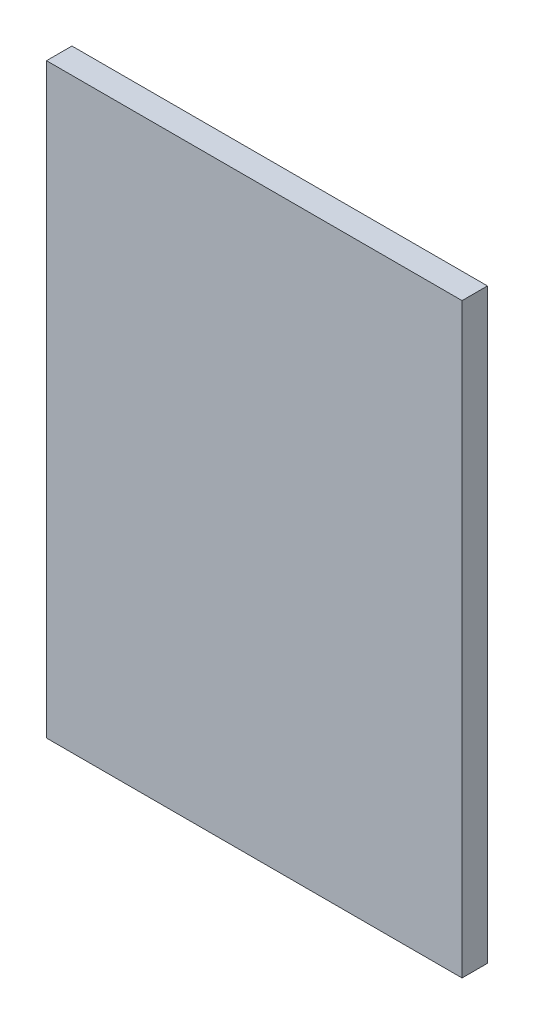
ISO-10303-21;
HEADER;
FILE_DESCRIPTION(('STEP AP214'),'2;1');
FILE_NAME('part.step','',(''),(''),'','','');
FILE_SCHEMA(('AUTOMOTIVE_DESIGN { 1 0 10303 214 1 1 1 1 }'));
ENDSEC;
DATA;
#1=APPLICATION_CONTEXT('core data for automotive mechanical design processes');
#2=APPLICATION_PROTOCOL_DEFINITION('international standard','automotive_design',2000,#1);
#3=PRODUCT_CONTEXT('',#1,'mechanical');
#4=PRODUCT('Part','Part','',(#3));
#5=PRODUCT_RELATED_PRODUCT_CATEGORY('part','',(#4));
#6=PRODUCT_DEFINITION_FORMATION('','',#4);
#7=PRODUCT_DEFINITION_CONTEXT('part definition',#1,'design');
#8=PRODUCT_DEFINITION('design','',#6,#7);
#9=PRODUCT_DEFINITION_SHAPE('','',#8);
#10=(LENGTH_UNIT() NAMED_UNIT(*) SI_UNIT(.MILLI.,.METRE.));
#11=(NAMED_UNIT(*) PLANE_ANGLE_UNIT() SI_UNIT($,.RADIAN.));
#12=(NAMED_UNIT(*) SI_UNIT($,.STERADIAN.) SOLID_ANGLE_UNIT());
#13=UNCERTAINTY_MEASURE_WITH_UNIT(LENGTH_MEASURE(1.E-05),#10,'distance_accuracy_value','');
#14=(GEOMETRIC_REPRESENTATION_CONTEXT(3) GLOBAL_UNCERTAINTY_ASSIGNED_CONTEXT((#13)) GLOBAL_UNIT_ASSIGNED_CONTEXT((#10,
#11,#12)) REPRESENTATION_CONTEXT('',''));
#15=CARTESIAN_POINT('',(0.,0.,0.));
#16=DIRECTION('',(0.,0.,1.));
#17=DIRECTION('',(1.,0.,0.));
#18=AXIS2_PLACEMENT_3D('',#15,#16,#17);
#19=CARTESIAN_POINT('',(-26.9875,-38.1,3.302));
#20=DIRECTION('',(1.,0.,0.));
#21=DIRECTION('',(0.,0.,-1.));
#22=AXIS2_PLACEMENT_3D('',#19,#20,#21);
#23=PLANE('',#22);
#24=DIRECTION('',(0.,-1.,0.));
#25=VECTOR('',#24,1.);
#26=CARTESIAN_POINT('',(-26.9875,-38.1,0.));
#27=LINE('',#26,#25);
#28=CARTESIAN_POINT('',(-26.9875,38.1,0.));
#29=VERTEX_POINT('',#28);
#30=CARTESIAN_POINT('',(-26.9875,-38.1,0.));
#31=VERTEX_POINT('',#30);
#32=EDGE_CURVE('E107',#29,#31,#27,.T.);
#33=ORIENTED_EDGE('',*,*,#32,.T.);
#34=DIRECTION('',(0.,0.,-1.));
#35=VECTOR('',#34,1.);
#36=CARTESIAN_POINT('',(-26.9875,-38.1,3.302));
#37=LINE('',#36,#35);
#38=CARTESIAN_POINT('',(-26.9875,-38.1,3.302));
#39=VERTEX_POINT('',#38);
#40=EDGE_CURVE('E11',#39,#31,#37,.T.);
#41=ORIENTED_EDGE('',*,*,#40,.F.);
#42=DIRECTION('',(0.,-1.,0.));
#43=VECTOR('',#42,1.);
#44=CARTESIAN_POINT('',(-26.9875,-38.1,3.302));
#45=LINE('',#44,#43);
#46=CARTESIAN_POINT('',(-26.9875,38.1,3.302));
#47=VERTEX_POINT('',#46);
#48=EDGE_CURVE('E91',#47,#39,#45,.T.);
#49=ORIENTED_EDGE('',*,*,#48,.F.);
#50=DIRECTION('',(0.,0.,-1.));
#51=VECTOR('',#50,1.);
#52=CARTESIAN_POINT('',(-26.9875,38.1,3.302));
#53=LINE('',#52,#51);
#54=EDGE_CURVE('E103',#47,#29,#53,.T.);
#55=ORIENTED_EDGE('',*,*,#54,.T.);
#56=EDGE_LOOP('',(#33,#41,#49,#55));
#57=FACE_BOUND('',#56,.T.);
#58=ADVANCED_FACE('F39',(#57),#23,.F.);
#59=CARTESIAN_POINT('',(26.9875,-38.1,3.302));
#60=DIRECTION('',(0.,1.,0.));
#61=DIRECTION('',(-1.,0.,0.));
#62=AXIS2_PLACEMENT_3D('',#59,#60,#61);
#63=PLANE('',#62);
#64=DIRECTION('',(1.,0.,0.));
#65=VECTOR('',#64,1.);
#66=CARTESIAN_POINT('',(26.9875,-38.1,0.));
#67=LINE('',#66,#65);
#68=CARTESIAN_POINT('',(26.9875,-38.1,0.));
#69=VERTEX_POINT('',#68);
#70=EDGE_CURVE('E96',#31,#69,#67,.T.);
#71=ORIENTED_EDGE('',*,*,#70,.T.);
#72=DIRECTION('',(0.,0.,-1.));
#73=VECTOR('',#72,1.);
#74=CARTESIAN_POINT('',(26.9875,-38.1,3.302));
#75=LINE('',#74,#73);
#76=CARTESIAN_POINT('',(26.9875,-38.1,3.302));
#77=VERTEX_POINT('',#76);
#78=EDGE_CURVE('E48',#77,#69,#75,.T.);
#79=ORIENTED_EDGE('',*,*,#78,.F.);
#80=DIRECTION('',(1.,0.,0.));
#81=VECTOR('',#80,1.);
#82=CARTESIAN_POINT('',(26.9875,-38.1,3.302));
#83=LINE('',#82,#81);
#84=EDGE_CURVE('E86',#39,#77,#83,.T.);
#85=ORIENTED_EDGE('',*,*,#84,.F.);
#86=ORIENTED_EDGE('',*,*,#40,.T.);
#87=EDGE_LOOP('',(#71,#79,#85,#86));
#88=FACE_BOUND('',#87,.T.);
#89=ADVANCED_FACE('F95',(#88),#63,.F.);
#90=CARTESIAN_POINT('',(26.9875,-38.1,3.302));
#91=DIRECTION('',(-1.,0.,0.));
#92=DIRECTION('',(0.,0.,1.));
#93=AXIS2_PLACEMENT_3D('',#90,#91,#92);
#94=PLANE('',#93);
#95=DIRECTION('',(0.,1.,0.));
#96=VECTOR('',#95,1.);
#97=CARTESIAN_POINT('',(26.9875,-38.1,0.));
#98=LINE('',#97,#96);
#99=CARTESIAN_POINT('',(26.9875,38.1,0.));
#100=VERTEX_POINT('',#99);
#101=EDGE_CURVE('E73',#69,#100,#98,.T.);
#102=ORIENTED_EDGE('',*,*,#101,.T.);
#103=DIRECTION('',(0.,0.,-1.));
#104=VECTOR('',#103,1.);
#105=CARTESIAN_POINT('',(26.9875,38.1,3.302));
#106=LINE('',#105,#104);
#107=CARTESIAN_POINT('',(26.9875,38.1,3.302));
#108=VERTEX_POINT('',#107);
#109=EDGE_CURVE('E98',#108,#100,#106,.T.);
#110=ORIENTED_EDGE('',*,*,#109,.F.);
#111=DIRECTION('',(0.,1.,0.));
#112=VECTOR('',#111,1.);
#113=CARTESIAN_POINT('',(26.9875,-38.1,3.302));
#114=LINE('',#113,#112);
#115=EDGE_CURVE('E89',#77,#108,#114,.T.);
#116=ORIENTED_EDGE('',*,*,#115,.F.);
#117=ORIENTED_EDGE('',*,*,#78,.T.);
#118=EDGE_LOOP('',(#102,#110,#116,#117));
#119=FACE_BOUND('',#118,.T.);
#120=ADVANCED_FACE('F99',(#119),#94,.F.);
#121=CARTESIAN_POINT('',(26.9875,38.1,3.302));
#122=DIRECTION('',(0.,-1.,0.));
#123=DIRECTION('',(1.,0.,0.));
#124=AXIS2_PLACEMENT_3D('',#121,#122,#123);
#125=PLANE('',#124);
#126=DIRECTION('',(-1.,0.,0.));
#127=VECTOR('',#126,1.);
#128=CARTESIAN_POINT('',(26.9875,38.1,0.));
#129=LINE('',#128,#127);
#130=EDGE_CURVE('E79',#100,#29,#129,.T.);
#131=ORIENTED_EDGE('',*,*,#130,.T.);
#132=ORIENTED_EDGE('',*,*,#54,.F.);
#133=DIRECTION('',(-1.,0.,0.));
#134=VECTOR('',#133,1.);
#135=CARTESIAN_POINT('',(26.9875,38.1,3.302));
#136=LINE('',#135,#134);
#137=EDGE_CURVE('E56',#108,#47,#136,.T.);
#138=ORIENTED_EDGE('',*,*,#137,.F.);
#139=ORIENTED_EDGE('',*,*,#109,.T.);
#140=EDGE_LOOP('',(#131,#132,#138,#139));
#141=FACE_BOUND('',#140,.T.);
#142=ADVANCED_FACE('F120',(#141),#125,.F.);
#143=CARTESIAN_POINT('',(0.,0.,3.302));
#144=DIRECTION('',(0.,0.,1.));
#145=DIRECTION('',(1.,0.,0.));
#146=AXIS2_PLACEMENT_3D('',#143,#144,#145);
#147=PLANE('',#146);
#148=ORIENTED_EDGE('',*,*,#48,.T.);
#149=ORIENTED_EDGE('',*,*,#84,.T.);
#150=ORIENTED_EDGE('',*,*,#115,.T.);
#151=ORIENTED_EDGE('',*,*,#137,.T.);
#152=EDGE_LOOP('',(#148,#149,#150,#151));
#153=FACE_BOUND('',#152,.T.);
#154=ADVANCED_FACE('F87',(#153),#147,.T.);
#155=CARTESIAN_POINT('',(0.,0.,0.));
#156=DIRECTION('',(0.,0.,1.));
#157=DIRECTION('',(1.,0.,0.));
#158=AXIS2_PLACEMENT_3D('',#155,#156,#157);
#159=PLANE('',#158);
#160=ORIENTED_EDGE('',*,*,#32,.F.);
#161=ORIENTED_EDGE('',*,*,#130,.F.);
#162=ORIENTED_EDGE('',*,*,#101,.F.);
#163=ORIENTED_EDGE('',*,*,#70,.F.);
#164=EDGE_LOOP('',(#160,#161,#162,#163));
#165=FACE_BOUND('',#164,.T.);
#166=ADVANCED_FACE('F123',(#165),#159,.F.);
#167=CLOSED_SHELL('',(#58,#89,#120,#142,#154,#166));
#168=MANIFOLD_SOLID_BREP('B2',#167);
#169=ADVANCED_BREP_SHAPE_REPRESENTATION('',(#18,#168),#14);
#170=SHAPE_DEFINITION_REPRESENTATION(#9,#169);
ENDSEC;
END-ISO-10303-21;
